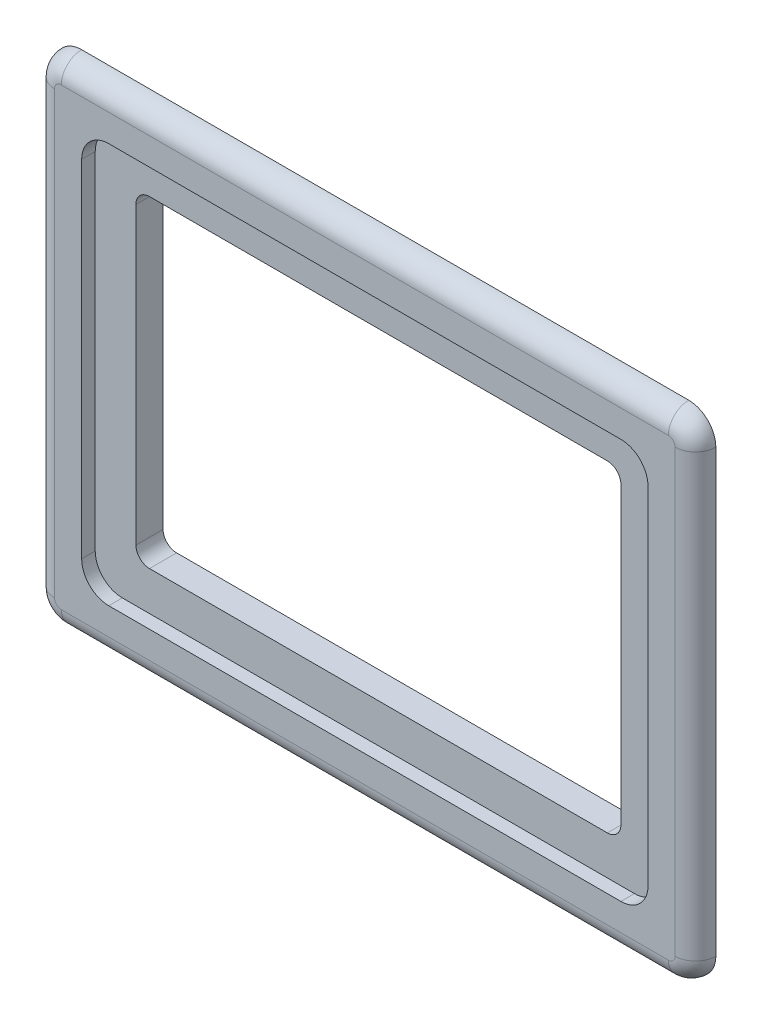
ISO-10303-21;
HEADER;
FILE_DESCRIPTION(('STEP AP214'),'2;1');
FILE_NAME('part.step','',(''),(''),'','','');
FILE_SCHEMA(('AUTOMOTIVE_DESIGN { 1 0 10303 214 1 1 1 1 }'));
ENDSEC;
DATA;
#1=APPLICATION_CONTEXT('core data for automotive mechanical design processes');
#2=APPLICATION_PROTOCOL_DEFINITION('international standard','automotive_design',2000,#1);
#3=PRODUCT_CONTEXT('',#1,'mechanical');
#4=PRODUCT('Part','Part','',(#3));
#5=PRODUCT_RELATED_PRODUCT_CATEGORY('part','',(#4));
#6=PRODUCT_DEFINITION_FORMATION('','',#4);
#7=PRODUCT_DEFINITION_CONTEXT('part definition',#1,'design');
#8=PRODUCT_DEFINITION('design','',#6,#7);
#9=PRODUCT_DEFINITION_SHAPE('','',#8);
#10=(LENGTH_UNIT() NAMED_UNIT(*) SI_UNIT(.MILLI.,.METRE.));
#11=(NAMED_UNIT(*) PLANE_ANGLE_UNIT() SI_UNIT($,.RADIAN.));
#12=(NAMED_UNIT(*) SI_UNIT($,.STERADIAN.) SOLID_ANGLE_UNIT());
#13=UNCERTAINTY_MEASURE_WITH_UNIT(LENGTH_MEASURE(1.E-05),#10,'distance_accuracy_value','');
#14=(GEOMETRIC_REPRESENTATION_CONTEXT(3) GLOBAL_UNCERTAINTY_ASSIGNED_CONTEXT((#13)) GLOBAL_UNIT_ASSIGNED_CONTEXT((#10,
#11,#12)) REPRESENTATION_CONTEXT('',''));
#15=CARTESIAN_POINT('',(0.,0.,0.));
#16=DIRECTION('',(0.,0.,1.));
#17=DIRECTION('',(1.,0.,0.));
#18=AXIS2_PLACEMENT_3D('',#15,#16,#17);
#19=CARTESIAN_POINT('',(113.50625,0.,9.525));
#20=DIRECTION('',(-1.,0.,0.));
#21=DIRECTION('',(0.,0.,1.));
#22=AXIS2_PLACEMENT_3D('',#19,#20,#21);
#23=PLANE('',#22);
#24=DIRECTION('',(0.,1.,0.));
#25=VECTOR('',#24,1.);
#26=CARTESIAN_POINT('',(113.50625,0.,-9.525));
#27=LINE('',#26,#25);
#28=CARTESIAN_POINT('',(113.50625,-69.05625,-9.525));
#29=VERTEX_POINT('',#28);
#30=CARTESIAN_POINT('',(113.50625,69.05625,-9.525));
#31=VERTEX_POINT('',#30);
#32=EDGE_CURVE('E447',#29,#31,#27,.T.);
#33=ORIENTED_EDGE('',*,*,#32,.F.);
#34=DIRECTION('',(0.,0.,-1.));
#35=VECTOR('',#34,1.);
#36=CARTESIAN_POINT('',(113.50625,-69.05625,3.175));
#37=LINE('',#36,#35);
#38=CARTESIAN_POINT('',(113.50625,-69.05625,3.175));
#39=VERTEX_POINT('',#38);
#40=EDGE_CURVE('E387',#29,#39,#37,.F.);
#41=ORIENTED_EDGE('',*,*,#40,.T.);
#42=DIRECTION('',(0.,-1.,0.));
#43=VECTOR('',#42,1.);
#44=CARTESIAN_POINT('',(113.50625,0.,3.175));
#45=LINE('',#44,#43);
#46=CARTESIAN_POINT('',(113.50625,69.05625,3.175));
#47=VERTEX_POINT('',#46);
#48=EDGE_CURVE('E506',#47,#39,#45,.T.);
#49=ORIENTED_EDGE('',*,*,#48,.F.);
#50=DIRECTION('',(0.,0.,-1.));
#51=VECTOR('',#50,1.);
#52=CARTESIAN_POINT('',(113.50625,69.05625,9.525));
#53=LINE('',#52,#51);
#54=EDGE_CURVE('E389',#47,#31,#53,.T.);
#55=ORIENTED_EDGE('',*,*,#54,.T.);
#56=EDGE_LOOP('',(#33,#41,#49,#55));
#57=FACE_BOUND('',#56,.T.);
#58=ADVANCED_FACE('F61',(#57),#23,.T.);
#59=CARTESIAN_POINT('',(0.,-75.40625,9.525));
#60=DIRECTION('',(0.,1.,0.));
#61=DIRECTION('',(0.,0.,1.));
#62=AXIS2_PLACEMENT_3D('',#59,#60,#61);
#63=PLANE('',#62);
#64=DIRECTION('',(-1.,0.,0.));
#65=VECTOR('',#64,1.);
#66=CARTESIAN_POINT('',(0.,-75.40625,3.175));
#67=LINE('',#66,#65);
#68=CARTESIAN_POINT('',(107.15625,-75.40625,3.175));
#69=VERTEX_POINT('',#68);
#70=CARTESIAN_POINT('',(-107.15625,-75.40625,3.175));
#71=VERTEX_POINT('',#70);
#72=EDGE_CURVE('E509',#69,#71,#67,.T.);
#73=ORIENTED_EDGE('',*,*,#72,.F.);
#74=DIRECTION('',(0.,0.,-1.));
#75=VECTOR('',#74,1.);
#76=CARTESIAN_POINT('',(107.15625,-75.40625,-9.525));
#77=LINE('',#76,#75);
#78=CARTESIAN_POINT('',(107.15625,-75.40625,-9.525));
#79=VERTEX_POINT('',#78);
#80=EDGE_CURVE('E392',#69,#79,#77,.T.);
#81=ORIENTED_EDGE('',*,*,#80,.T.);
#82=DIRECTION('',(1.,0.,0.));
#83=VECTOR('',#82,1.);
#84=CARTESIAN_POINT('',(0.,-75.40625,-9.525));
#85=LINE('',#84,#83);
#86=CARTESIAN_POINT('',(-107.15625,-75.40625,-9.525));
#87=VERTEX_POINT('',#86);
#88=EDGE_CURVE('E475',#87,#79,#85,.T.);
#89=ORIENTED_EDGE('',*,*,#88,.F.);
#90=DIRECTION('',(0.,0.,-1.));
#91=VECTOR('',#90,1.);
#92=CARTESIAN_POINT('',(-107.15625,-75.40625,9.525));
#93=LINE('',#92,#91);
#94=EDGE_CURVE('E395',#87,#71,#93,.F.);
#95=ORIENTED_EDGE('',*,*,#94,.T.);
#96=EDGE_LOOP('',(#73,#81,#89,#95));
#97=FACE_BOUND('',#96,.T.);
#98=ADVANCED_FACE('F532',(#97),#63,.T.);
#99=CARTESIAN_POINT('',(-113.50625,0.,9.525));
#100=DIRECTION('',(-1.,0.,0.));
#101=DIRECTION('',(0.,0.,1.));
#102=AXIS2_PLACEMENT_3D('',#99,#100,#101);
#103=PLANE('',#102);
#104=DIRECTION('',(0.,-1.,0.));
#105=VECTOR('',#104,1.);
#106=CARTESIAN_POINT('',(-113.50625,0.,3.175));
#107=LINE('',#106,#105);
#108=CARTESIAN_POINT('',(-113.50625,69.05625,3.175));
#109=VERTEX_POINT('',#108);
#110=CARTESIAN_POINT('',(-113.50625,-69.05625,3.175));
#111=VERTEX_POINT('',#110);
#112=EDGE_CURVE('E512',#109,#111,#107,.T.);
#113=ORIENTED_EDGE('',*,*,#112,.T.);
#114=DIRECTION('',(0.,0.,-1.));
#115=VECTOR('',#114,1.);
#116=CARTESIAN_POINT('',(-113.50625,-69.05625,9.525));
#117=LINE('',#116,#115);
#118=CARTESIAN_POINT('',(-113.50625,-69.05625,-9.525));
#119=VERTEX_POINT('',#118);
#120=EDGE_CURVE('E382',#111,#119,#117,.T.);
#121=ORIENTED_EDGE('',*,*,#120,.T.);
#122=DIRECTION('',(0.,1.,0.));
#123=VECTOR('',#122,1.);
#124=CARTESIAN_POINT('',(-113.50625,0.,-9.525));
#125=LINE('',#124,#123);
#126=CARTESIAN_POINT('',(-113.50625,69.05625,-9.525));
#127=VERTEX_POINT('',#126);
#128=EDGE_CURVE('E472',#119,#127,#125,.T.);
#129=ORIENTED_EDGE('',*,*,#128,.T.);
#130=DIRECTION('',(0.,0.,-1.));
#131=VECTOR('',#130,1.);
#132=CARTESIAN_POINT('',(-113.50625,69.05625,3.175));
#133=LINE('',#132,#131);
#134=EDGE_CURVE('E385',#127,#109,#133,.F.);
#135=ORIENTED_EDGE('',*,*,#134,.T.);
#136=EDGE_LOOP('',(#113,#121,#129,#135));
#137=FACE_BOUND('',#136,.T.);
#138=ADVANCED_FACE('F517',(#137),#103,.F.);
#139=CARTESIAN_POINT('',(0.,75.40625,9.525));
#140=DIRECTION('',(0.,1.,0.));
#141=DIRECTION('',(0.,0.,1.));
#142=AXIS2_PLACEMENT_3D('',#139,#140,#141);
#143=PLANE('',#142);
#144=DIRECTION('',(1.,0.,0.));
#145=VECTOR('',#144,1.);
#146=CARTESIAN_POINT('',(0.,75.40625,-9.525));
#147=LINE('',#146,#145);
#148=CARTESIAN_POINT('',(-107.15625,75.40625,-9.525));
#149=VERTEX_POINT('',#148);
#150=CARTESIAN_POINT('',(107.15625,75.40625,-9.525));
#151=VERTEX_POINT('',#150);
#152=EDGE_CURVE('E469',#149,#151,#147,.T.);
#153=ORIENTED_EDGE('',*,*,#152,.T.);
#154=DIRECTION('',(0.,0.,-1.));
#155=VECTOR('',#154,1.);
#156=CARTESIAN_POINT('',(107.15625,75.40625,9.525));
#157=LINE('',#156,#155);
#158=CARTESIAN_POINT('',(107.15625,75.40625,3.175));
#159=VERTEX_POINT('',#158);
#160=EDGE_CURVE('E377',#151,#159,#157,.F.);
#161=ORIENTED_EDGE('',*,*,#160,.T.);
#162=DIRECTION('',(-1.,0.,0.));
#163=VECTOR('',#162,1.);
#164=CARTESIAN_POINT('',(0.,75.40625,3.175));
#165=LINE('',#164,#163);
#166=CARTESIAN_POINT('',(-107.15625,75.40625,3.175));
#167=VERTEX_POINT('',#166);
#168=EDGE_CURVE('E493',#159,#167,#165,.T.);
#169=ORIENTED_EDGE('',*,*,#168,.T.);
#170=DIRECTION('',(0.,0.,-1.));
#171=VECTOR('',#170,1.);
#172=CARTESIAN_POINT('',(-107.15625,75.40625,-9.525));
#173=LINE('',#172,#171);
#174=EDGE_CURVE('E379',#167,#149,#173,.T.);
#175=ORIENTED_EDGE('',*,*,#174,.T.);
#176=EDGE_LOOP('',(#153,#161,#169,#175));
#177=FACE_BOUND('',#176,.T.);
#178=ADVANCED_FACE('F548',(#177),#143,.F.);
#179=CARTESIAN_POINT('',(0.,0.,9.525));
#180=DIRECTION('',(0.,0.,1.));
#181=DIRECTION('',(1.,0.,0.));
#182=AXIS2_PLACEMENT_3D('',#179,#180,#181);
#183=PLANE('',#182);
#184=DIRECTION('',(0.,1.,0.));
#185=VECTOR('',#184,1.);
#186=CARTESIAN_POINT('',(-145.25625,0.,9.525));
#187=LINE('',#186,#185);
#188=CARTESIAN_POINT('',(-145.25625,103.1875,9.525));
#189=VERTEX_POINT('',#188);
#190=CARTESIAN_POINT('',(-145.25625,-103.1875,9.525));
#191=VERTEX_POINT('',#190);
#192=EDGE_CURVE('E323',#189,#191,#187,.F.);
#193=ORIENTED_EDGE('',*,*,#192,.T.);
#194=CARTESIAN_POINT('',(-142.08125,-103.1875,9.525));
#195=DIRECTION('',(0.,0.,1.));
#196=DIRECTION('',(1.,0.,0.));
#197=AXIS2_PLACEMENT_3D('',#194,#195,#196);
#198=CIRCLE('',#197,3.175);
#199=CARTESIAN_POINT('',(-142.08125,-106.3625,9.525));
#200=VERTEX_POINT('',#199);
#201=EDGE_CURVE('E12',#191,#200,#198,.T.);
#202=ORIENTED_EDGE('',*,*,#201,.T.);
#203=DIRECTION('',(1.,0.,0.));
#204=VECTOR('',#203,1.);
#205=CARTESIAN_POINT('',(142.08125,-106.3625,9.525));
#206=LINE('',#205,#204);
#207=CARTESIAN_POINT('',(142.08125,-106.3625,9.525));
#208=VERTEX_POINT('',#207);
#209=EDGE_CURVE('E70',#200,#208,#206,.T.);
#210=ORIENTED_EDGE('',*,*,#209,.T.);
#211=CARTESIAN_POINT('',(142.08125,-103.1875,9.525));
#212=DIRECTION('',(0.,0.,1.));
#213=DIRECTION('',(1.,0.,0.));
#214=AXIS2_PLACEMENT_3D('',#211,#212,#213);
#215=CIRCLE('',#214,3.175);
#216=CARTESIAN_POINT('',(145.25625,-103.1875,9.525));
#217=VERTEX_POINT('',#216);
#218=EDGE_CURVE('E314',#208,#217,#215,.T.);
#219=ORIENTED_EDGE('',*,*,#218,.T.);
#220=DIRECTION('',(0.,1.,0.));
#221=VECTOR('',#220,1.);
#222=CARTESIAN_POINT('',(145.25625,103.1875,9.525));
#223=LINE('',#222,#221);
#224=CARTESIAN_POINT('',(145.25625,103.1875,9.525));
#225=VERTEX_POINT('',#224);
#226=EDGE_CURVE('E316',#217,#225,#223,.T.);
#227=ORIENTED_EDGE('',*,*,#226,.T.);
#228=CARTESIAN_POINT('',(142.08125,103.1875,9.525));
#229=DIRECTION('',(0.,0.,1.));
#230=DIRECTION('',(1.,0.,0.));
#231=AXIS2_PLACEMENT_3D('',#228,#229,#230);
#232=CIRCLE('',#231,3.175);
#233=CARTESIAN_POINT('',(142.08125,106.3625,9.525));
#234=VERTEX_POINT('',#233);
#235=EDGE_CURVE('E318',#225,#234,#232,.T.);
#236=ORIENTED_EDGE('',*,*,#235,.T.);
#237=DIRECTION('',(1.,0.,0.));
#238=VECTOR('',#237,1.);
#239=CARTESIAN_POINT('',(0.,106.3625,9.525));
#240=LINE('',#239,#238);
#241=CARTESIAN_POINT('',(-142.08125,106.3625,9.525));
#242=VERTEX_POINT('',#241);
#243=EDGE_CURVE('E320',#234,#242,#240,.F.);
#244=ORIENTED_EDGE('',*,*,#243,.T.);
#245=CARTESIAN_POINT('',(-142.08125,103.1875,9.525));
#246=DIRECTION('',(0.,0.,1.));
#247=DIRECTION('',(1.,0.,0.));
#248=AXIS2_PLACEMENT_3D('',#245,#246,#247);
#249=CIRCLE('',#248,3.175);
#250=EDGE_CURVE('E297',#242,#189,#249,.T.);
#251=ORIENTED_EDGE('',*,*,#250,.T.);
#252=EDGE_LOOP('',(#193,#202,#210,#219,#227,#236,#244,#251));
#253=FACE_BOUND('',#252,.T.);
#254=DIRECTION('',(0.,-1.,0.));
#255=VECTOR('',#254,1.);
#256=CARTESIAN_POINT('',(-132.55625,0.,9.525));
#257=LINE('',#256,#255);
#258=CARTESIAN_POINT('',(-132.55625,80.9625,9.525));
#259=VERTEX_POINT('',#258);
#260=CARTESIAN_POINT('',(-132.55625,-80.9625,9.525));
#261=VERTEX_POINT('',#260);
#262=EDGE_CURVE('E490',#259,#261,#257,.T.);
#263=ORIENTED_EDGE('',*,*,#262,.F.);
#264=CARTESIAN_POINT('',(-119.85625,80.9625,9.525));
#265=DIRECTION('',(0.,0.,1.));
#266=DIRECTION('',(1.,0.,0.));
#267=AXIS2_PLACEMENT_3D('',#264,#265,#266);
#268=CIRCLE('',#267,12.7);
#269=CARTESIAN_POINT('',(-119.85625,93.6625,9.525));
#270=VERTEX_POINT('',#269);
#271=EDGE_CURVE('E325',#259,#270,#268,.F.);
#272=ORIENTED_EDGE('',*,*,#271,.T.);
#273=DIRECTION('',(-1.,0.,0.));
#274=VECTOR('',#273,1.);
#275=CARTESIAN_POINT('',(0.,93.6625,9.525));
#276=LINE('',#275,#274);
#277=CARTESIAN_POINT('',(119.85625,93.6625,9.525));
#278=VERTEX_POINT('',#277);
#279=EDGE_CURVE('E480',#278,#270,#276,.T.);
#280=ORIENTED_EDGE('',*,*,#279,.F.);
#281=CARTESIAN_POINT('',(119.85625,80.9625,9.525));
#282=DIRECTION('',(0.,0.,1.));
#283=DIRECTION('',(1.,0.,0.));
#284=AXIS2_PLACEMENT_3D('',#281,#282,#283);
#285=CIRCLE('',#284,12.7);
#286=CARTESIAN_POINT('',(132.55625,80.9625,9.525));
#287=VERTEX_POINT('',#286);
#288=EDGE_CURVE('E331',#278,#287,#285,.F.);
#289=ORIENTED_EDGE('',*,*,#288,.T.);
#290=DIRECTION('',(0.,-1.,0.));
#291=VECTOR('',#290,1.);
#292=CARTESIAN_POINT('',(132.55625,0.,9.525));
#293=LINE('',#292,#291);
#294=CARTESIAN_POINT('',(132.55625,-80.9625,9.525));
#295=VERTEX_POINT('',#294);
#296=EDGE_CURVE('E484',#287,#295,#293,.T.);
#297=ORIENTED_EDGE('',*,*,#296,.T.);
#298=CARTESIAN_POINT('',(119.85625,-80.9625,9.525));
#299=DIRECTION('',(0.,0.,1.));
#300=DIRECTION('',(1.,0.,0.));
#301=AXIS2_PLACEMENT_3D('',#298,#299,#300);
#302=CIRCLE('',#301,12.7);
#303=CARTESIAN_POINT('',(119.85625,-93.6625,9.525));
#304=VERTEX_POINT('',#303);
#305=EDGE_CURVE('E329',#295,#304,#302,.F.);
#306=ORIENTED_EDGE('',*,*,#305,.T.);
#307=DIRECTION('',(-1.,0.,0.));
#308=VECTOR('',#307,1.);
#309=CARTESIAN_POINT('',(0.,-93.6625,9.525));
#310=LINE('',#309,#308);
#311=CARTESIAN_POINT('',(-119.85625,-93.6625,9.525));
#312=VERTEX_POINT('',#311);
#313=EDGE_CURVE('E487',#304,#312,#310,.T.);
#314=ORIENTED_EDGE('',*,*,#313,.T.);
#315=CARTESIAN_POINT('',(-119.85625,-80.9625,9.525));
#316=DIRECTION('',(0.,0.,1.));
#317=DIRECTION('',(1.,0.,0.));
#318=AXIS2_PLACEMENT_3D('',#315,#316,#317);
#319=CIRCLE('',#318,12.7);
#320=EDGE_CURVE('E327',#312,#261,#319,.F.);
#321=ORIENTED_EDGE('',*,*,#320,.T.);
#322=EDGE_LOOP('',(#263,#272,#280,#289,#297,#306,#314,#321));
#323=FACE_BOUND('',#322,.T.);
#324=ADVANCED_FACE('F575',(#253,#323),#183,.T.);
#325=CARTESIAN_POINT('',(0.,0.,0.));
#326=DIRECTION('',(0.,0.,1.));
#327=DIRECTION('',(1.,0.,0.));
#328=AXIS2_PLACEMENT_3D('',#325,#326,#327);
#329=PLANE('',#328);
#330=DIRECTION('',(0.,1.,0.));
#331=VECTOR('',#330,1.);
#332=CARTESIAN_POINT('',(-132.55625,0.,0.));
#333=LINE('',#332,#331);
#334=CARTESIAN_POINT('',(-132.55625,-80.9625,0.));
#335=VERTEX_POINT('',#334);
#336=CARTESIAN_POINT('',(-132.55625,80.9625,0.));
#337=VERTEX_POINT('',#336);
#338=EDGE_CURVE('E444',#335,#337,#333,.T.);
#339=ORIENTED_EDGE('',*,*,#338,.F.);
#340=CARTESIAN_POINT('',(-119.85625,-80.9625,0.));
#341=DIRECTION('',(0.,0.,1.));
#342=DIRECTION('',(1.,0.,0.));
#343=AXIS2_PLACEMENT_3D('',#340,#341,#342);
#344=CIRCLE('',#343,12.7);
#345=CARTESIAN_POINT('',(-119.85625,-93.6625,0.));
#346=VERTEX_POINT('',#345);
#347=EDGE_CURVE('E397',#335,#346,#344,.T.);
#348=ORIENTED_EDGE('',*,*,#347,.T.);
#349=DIRECTION('',(1.,0.,0.));
#350=VECTOR('',#349,1.);
#351=CARTESIAN_POINT('',(0.,-93.6625,0.));
#352=LINE('',#351,#350);
#353=CARTESIAN_POINT('',(119.85625,-93.6625,0.));
#354=VERTEX_POINT('',#353);
#355=EDGE_CURVE('E454',#346,#354,#352,.T.);
#356=ORIENTED_EDGE('',*,*,#355,.T.);
#357=CARTESIAN_POINT('',(119.85625,-80.9625,0.));
#358=DIRECTION('',(0.,0.,1.));
#359=DIRECTION('',(1.,0.,0.));
#360=AXIS2_PLACEMENT_3D('',#357,#358,#359);
#361=CIRCLE('',#360,12.7);
#362=CARTESIAN_POINT('',(132.55625,-80.9625,0.));
#363=VERTEX_POINT('',#362);
#364=EDGE_CURVE('E403',#354,#363,#361,.T.);
#365=ORIENTED_EDGE('',*,*,#364,.T.);
#366=DIRECTION('',(0.,1.,0.));
#367=VECTOR('',#366,1.);
#368=CARTESIAN_POINT('',(132.55625,0.,0.));
#369=LINE('',#368,#367);
#370=CARTESIAN_POINT('',(132.55625,80.9624999999999,0.));
#371=VERTEX_POINT('',#370);
#372=EDGE_CURVE('E451',#363,#371,#369,.T.);
#373=ORIENTED_EDGE('',*,*,#372,.T.);
#374=CARTESIAN_POINT('',(119.85625,80.9624999999999,0.));
#375=DIRECTION('',(0.,0.,1.));
#376=DIRECTION('',(1.,0.,0.));
#377=AXIS2_PLACEMENT_3D('',#374,#375,#376);
#378=CIRCLE('',#377,12.7);
#379=CARTESIAN_POINT('',(119.85625,93.6625,0.));
#380=VERTEX_POINT('',#379);
#381=EDGE_CURVE('E401',#371,#380,#378,.T.);
#382=ORIENTED_EDGE('',*,*,#381,.T.);
#383=DIRECTION('',(1.,0.,0.));
#384=VECTOR('',#383,1.);
#385=CARTESIAN_POINT('',(0.,93.6625,0.));
#386=LINE('',#385,#384);
#387=CARTESIAN_POINT('',(-119.85625,93.6625,0.));
#388=VERTEX_POINT('',#387);
#389=EDGE_CURVE('E448',#388,#380,#386,.T.);
#390=ORIENTED_EDGE('',*,*,#389,.F.);
#391=CARTESIAN_POINT('',(-119.85625,80.9625,0.));
#392=DIRECTION('',(0.,0.,1.));
#393=DIRECTION('',(1.,0.,0.));
#394=AXIS2_PLACEMENT_3D('',#391,#392,#393);
#395=CIRCLE('',#394,12.7);
#396=EDGE_CURVE('E399',#388,#337,#395,.T.);
#397=ORIENTED_EDGE('',*,*,#396,.T.);
#398=EDGE_LOOP('',(#339,#348,#356,#365,#373,#382,#390,#397));
#399=FACE_BOUND('',#398,.T.);
#400=DIRECTION('',(1.,0.,0.));
#401=VECTOR('',#400,1.);
#402=CARTESIAN_POINT('',(0.,115.8875,0.));
#403=LINE('',#402,#401);
#404=CARTESIAN_POINT('',(-142.08125,115.8875,0.));
#405=VERTEX_POINT('',#404);
#406=CARTESIAN_POINT('',(142.08125,115.8875,0.));
#407=VERTEX_POINT('',#406);
#408=EDGE_CURVE('E274',#405,#407,#403,.T.);
#409=ORIENTED_EDGE('',*,*,#408,.T.);
#410=CARTESIAN_POINT('',(142.08125,103.1875,0.));
#411=DIRECTION('',(0.,0.,1.));
#412=DIRECTION('',(1.,0.,0.));
#413=AXIS2_PLACEMENT_3D('',#410,#411,#412);
#414=CIRCLE('',#413,12.7);
#415=CARTESIAN_POINT('',(154.78125,103.1875,0.));
#416=VERTEX_POINT('',#415);
#417=EDGE_CURVE('E433',#407,#416,#414,.F.);
#418=ORIENTED_EDGE('',*,*,#417,.T.);
#419=DIRECTION('',(0.,1.,0.));
#420=VECTOR('',#419,1.);
#421=CARTESIAN_POINT('',(154.78125,0.,0.));
#422=LINE('',#421,#420);
#423=CARTESIAN_POINT('',(154.78125,-103.1875,0.));
#424=VERTEX_POINT('',#423);
#425=EDGE_CURVE('E294',#424,#416,#422,.T.);
#426=ORIENTED_EDGE('',*,*,#425,.F.);
#427=CARTESIAN_POINT('',(142.08125,-103.1875,0.));
#428=DIRECTION('',(0.,0.,1.));
#429=DIRECTION('',(1.,0.,0.));
#430=AXIS2_PLACEMENT_3D('',#427,#428,#429);
#431=CIRCLE('',#430,12.7);
#432=CARTESIAN_POINT('',(142.08125,-115.8875,0.));
#433=VERTEX_POINT('',#432);
#434=EDGE_CURVE('E283',#424,#433,#431,.F.);
#435=ORIENTED_EDGE('',*,*,#434,.T.);
#436=DIRECTION('',(1.,0.,0.));
#437=VECTOR('',#436,1.);
#438=CARTESIAN_POINT('',(0.,-115.8875,0.));
#439=LINE('',#438,#437);
#440=CARTESIAN_POINT('',(-142.08125,-115.8875,0.));
#441=VERTEX_POINT('',#440);
#442=EDGE_CURVE('E440',#441,#433,#439,.T.);
#443=ORIENTED_EDGE('',*,*,#442,.F.);
#444=CARTESIAN_POINT('',(-142.08125,-103.1875,0.));
#445=DIRECTION('',(0.,0.,1.));
#446=DIRECTION('',(1.,0.,0.));
#447=AXIS2_PLACEMENT_3D('',#444,#445,#446);
#448=CIRCLE('',#447,12.7);
#449=CARTESIAN_POINT('',(-154.78125,-103.1875,0.));
#450=VERTEX_POINT('',#449);
#451=EDGE_CURVE('E284',#441,#450,#448,.F.);
#452=ORIENTED_EDGE('',*,*,#451,.T.);
#453=DIRECTION('',(0.,1.,0.));
#454=VECTOR('',#453,1.);
#455=CARTESIAN_POINT('',(-154.78125,0.,0.));
#456=LINE('',#455,#454);
#457=CARTESIAN_POINT('',(-154.78125,103.1875,0.));
#458=VERTEX_POINT('',#457);
#459=EDGE_CURVE('E278',#450,#458,#456,.T.);
#460=ORIENTED_EDGE('',*,*,#459,.T.);
#461=CARTESIAN_POINT('',(-142.08125,103.1875,0.));
#462=DIRECTION('',(0.,0.,1.));
#463=DIRECTION('',(1.,0.,0.));
#464=AXIS2_PLACEMENT_3D('',#461,#462,#463);
#465=CIRCLE('',#464,12.7);
#466=EDGE_CURVE('E271',#458,#405,#465,.F.);
#467=ORIENTED_EDGE('',*,*,#466,.T.);
#468=EDGE_LOOP('',(#409,#418,#426,#435,#443,#452,#460,#467));
#469=FACE_BOUND('',#468,.T.);
#470=ADVANCED_FACE('F273',(#399,#469),#329,.F.);
#471=CARTESIAN_POINT('',(0.,-93.6625,-9.525));
#472=DIRECTION('',(0.,-1.,0.));
#473=DIRECTION('',(0.,0.,-1.));
#474=AXIS2_PLACEMENT_3D('',#471,#472,#473);
#475=PLANE('',#474);
#476=DIRECTION('',(1.,0.,0.));
#477=VECTOR('',#476,1.);
#478=CARTESIAN_POINT('',(0.,-93.6625,-9.525));
#479=LINE('',#478,#477);
#480=CARTESIAN_POINT('',(-119.85625,-93.6625,-9.525));
#481=VERTEX_POINT('',#480);
#482=CARTESIAN_POINT('',(119.85625,-93.6625,-9.525));
#483=VERTEX_POINT('',#482);
#484=EDGE_CURVE('E466',#481,#483,#479,.T.);
#485=ORIENTED_EDGE('',*,*,#484,.T.);
#486=DIRECTION('',(0.,0.,1.));
#487=VECTOR('',#486,1.);
#488=CARTESIAN_POINT('',(119.85625,-93.6625,-9.525));
#489=LINE('',#488,#487);
#490=EDGE_CURVE('E428',#483,#354,#489,.T.);
#491=ORIENTED_EDGE('',*,*,#490,.T.);
#492=ORIENTED_EDGE('',*,*,#355,.F.);
#493=DIRECTION('',(0.,0.,1.));
#494=VECTOR('',#493,1.);
#495=CARTESIAN_POINT('',(-119.85625,-93.6625,-9.525));
#496=LINE('',#495,#494);
#497=EDGE_CURVE('E431',#346,#481,#496,.F.);
#498=ORIENTED_EDGE('',*,*,#497,.T.);
#499=EDGE_LOOP('',(#485,#491,#492,#498));
#500=FACE_BOUND('',#499,.T.);
#501=ADVANCED_FACE('F684',(#500),#475,.T.);
#502=CARTESIAN_POINT('',(-132.55625,0.,-9.525));
#503=DIRECTION('',(1.,0.,0.));
#504=DIRECTION('',(0.,0.,-1.));
#505=AXIS2_PLACEMENT_3D('',#502,#503,#504);
#506=PLANE('',#505);
#507=ORIENTED_EDGE('',*,*,#338,.T.);
#508=DIRECTION('',(0.,0.,1.));
#509=VECTOR('',#508,1.);
#510=CARTESIAN_POINT('',(-132.55625,80.9625,-9.525));
#511=LINE('',#510,#509);
#512=CARTESIAN_POINT('',(-132.55625,80.9625,-9.525));
#513=VERTEX_POINT('',#512);
#514=EDGE_CURVE('E405',#337,#513,#511,.F.);
#515=ORIENTED_EDGE('',*,*,#514,.T.);
#516=DIRECTION('',(0.,1.,0.));
#517=VECTOR('',#516,1.);
#518=CARTESIAN_POINT('',(-132.55625,0.,-9.525));
#519=LINE('',#518,#517);
#520=CARTESIAN_POINT('',(-132.55625,-80.9625,-9.525));
#521=VERTEX_POINT('',#520);
#522=EDGE_CURVE('E443',#521,#513,#519,.T.);
#523=ORIENTED_EDGE('',*,*,#522,.F.);
#524=DIRECTION('',(0.,0.,1.));
#525=VECTOR('',#524,1.);
#526=CARTESIAN_POINT('',(-132.55625,-80.9625,0.));
#527=LINE('',#526,#525);
#528=EDGE_CURVE('E407',#521,#335,#527,.T.);
#529=ORIENTED_EDGE('',*,*,#528,.T.);
#530=EDGE_LOOP('',(#507,#515,#523,#529));
#531=FACE_BOUND('',#530,.T.);
#532=ADVANCED_FACE('F865',(#531),#506,.F.);
#533=CARTESIAN_POINT('',(0.,93.6625,-9.525));
#534=DIRECTION('',(0.,-1.,0.));
#535=DIRECTION('',(0.,0.,-1.));
#536=AXIS2_PLACEMENT_3D('',#533,#534,#535);
#537=PLANE('',#536);
#538=ORIENTED_EDGE('',*,*,#389,.T.);
#539=DIRECTION('',(0.,0.,1.));
#540=VECTOR('',#539,1.);
#541=CARTESIAN_POINT('',(119.85625,93.6625,-9.525));
#542=LINE('',#541,#540);
#543=CARTESIAN_POINT('',(119.85625,93.6625,-9.525));
#544=VERTEX_POINT('',#543);
#545=EDGE_CURVE('E410',#380,#544,#542,.F.);
#546=ORIENTED_EDGE('',*,*,#545,.T.);
#547=DIRECTION('',(1.,0.,0.));
#548=VECTOR('',#547,1.);
#549=CARTESIAN_POINT('',(0.,93.6625,-9.525));
#550=LINE('',#549,#548);
#551=CARTESIAN_POINT('',(-119.85625,93.6625,-9.525));
#552=VERTEX_POINT('',#551);
#553=EDGE_CURVE('E460',#552,#544,#550,.T.);
#554=ORIENTED_EDGE('',*,*,#553,.F.);
#555=DIRECTION('',(0.,0.,1.));
#556=VECTOR('',#555,1.);
#557=CARTESIAN_POINT('',(-119.85625,93.6625,-9.525));
#558=LINE('',#557,#556);
#559=EDGE_CURVE('E412',#552,#388,#558,.T.);
#560=ORIENTED_EDGE('',*,*,#559,.T.);
#561=EDGE_LOOP('',(#538,#546,#554,#560));
#562=FACE_BOUND('',#561,.T.);
#563=ADVANCED_FACE('F871',(#562),#537,.F.);
#564=CARTESIAN_POINT('',(132.55625,0.,-9.525));
#565=DIRECTION('',(1.,0.,0.));
#566=DIRECTION('',(0.,0.,-1.));
#567=AXIS2_PLACEMENT_3D('',#564,#565,#566);
#568=PLANE('',#567);
#569=ORIENTED_EDGE('',*,*,#372,.F.);
#570=DIRECTION('',(0.,0.,1.));
#571=VECTOR('',#570,1.);
#572=CARTESIAN_POINT('',(132.55625,-80.9625,-9.525));
#573=LINE('',#572,#571);
#574=CARTESIAN_POINT('',(132.55625,-80.9625,-9.525));
#575=VERTEX_POINT('',#574);
#576=EDGE_CURVE('E423',#363,#575,#573,.F.);
#577=ORIENTED_EDGE('',*,*,#576,.T.);
#578=DIRECTION('',(0.,1.,0.));
#579=VECTOR('',#578,1.);
#580=CARTESIAN_POINT('',(132.55625,0.,-9.525));
#581=LINE('',#580,#579);
#582=CARTESIAN_POINT('',(132.55625,80.9624999999999,-9.525));
#583=VERTEX_POINT('',#582);
#584=EDGE_CURVE('E463',#575,#583,#581,.T.);
#585=ORIENTED_EDGE('',*,*,#584,.T.);
#586=DIRECTION('',(0.,0.,1.));
#587=VECTOR('',#586,1.);
#588=CARTESIAN_POINT('',(132.55625,80.9624999999999,0.));
#589=LINE('',#588,#587);
#590=EDGE_CURVE('E425',#583,#371,#589,.T.);
#591=ORIENTED_EDGE('',*,*,#590,.T.);
#592=EDGE_LOOP('',(#569,#577,#585,#591));
#593=FACE_BOUND('',#592,.T.);
#594=ADVANCED_FACE('F710',(#593),#568,.T.);
#595=CARTESIAN_POINT('',(0.,0.,-9.525));
#596=DIRECTION('',(0.,0.,1.));
#597=DIRECTION('',(1.,0.,0.));
#598=AXIS2_PLACEMENT_3D('',#595,#596,#597);
#599=PLANE('',#598);
#600=ORIENTED_EDGE('',*,*,#88,.T.);
#601=CARTESIAN_POINT('',(107.15625,-69.05625,-9.525));
#602=DIRECTION('',(0.,0.,1.));
#603=DIRECTION('',(1.,0.,0.));
#604=AXIS2_PLACEMENT_3D('',#601,#602,#603);
#605=CIRCLE('',#604,6.35);
#606=EDGE_CURVE('E375',#79,#29,#605,.T.);
#607=ORIENTED_EDGE('',*,*,#606,.T.);
#608=ORIENTED_EDGE('',*,*,#32,.T.);
#609=CARTESIAN_POINT('',(107.15625,69.05625,-9.525));
#610=DIRECTION('',(0.,0.,1.));
#611=DIRECTION('',(1.,0.,0.));
#612=AXIS2_PLACEMENT_3D('',#609,#610,#611);
#613=CIRCLE('',#612,6.35);
#614=EDGE_CURVE('E367',#31,#151,#613,.T.);
#615=ORIENTED_EDGE('',*,*,#614,.T.);
#616=ORIENTED_EDGE('',*,*,#152,.F.);
#617=CARTESIAN_POINT('',(-107.15625,69.05625,-9.525));
#618=DIRECTION('',(0.,0.,1.));
#619=DIRECTION('',(1.,0.,0.));
#620=AXIS2_PLACEMENT_3D('',#617,#618,#619);
#621=CIRCLE('',#620,6.35);
#622=EDGE_CURVE('E363',#149,#127,#621,.T.);
#623=ORIENTED_EDGE('',*,*,#622,.T.);
#624=ORIENTED_EDGE('',*,*,#128,.F.);
#625=CARTESIAN_POINT('',(-107.15625,-69.05625,-9.525));
#626=DIRECTION('',(0.,0.,1.));
#627=DIRECTION('',(1.,0.,0.));
#628=AXIS2_PLACEMENT_3D('',#625,#626,#627);
#629=CIRCLE('',#628,6.35);
#630=EDGE_CURVE('E371',#119,#87,#629,.T.);
#631=ORIENTED_EDGE('',*,*,#630,.T.);
#632=EDGE_LOOP('',(#600,#607,#608,#615,#616,#623,#624,#631));
#633=FACE_BOUND('',#632,.T.);
#634=ORIENTED_EDGE('',*,*,#584,.F.);
#635=CARTESIAN_POINT('',(119.85625,-80.9625,-9.525));
#636=DIRECTION('',(0.,0.,1.));
#637=DIRECTION('',(1.,0.,0.));
#638=AXIS2_PLACEMENT_3D('',#635,#636,#637);
#639=CIRCLE('',#638,12.7);
#640=EDGE_CURVE('E415',#575,#483,#639,.F.);
#641=ORIENTED_EDGE('',*,*,#640,.T.);
#642=ORIENTED_EDGE('',*,*,#484,.F.);
#643=CARTESIAN_POINT('',(-119.85625,-80.9625,-9.525));
#644=DIRECTION('',(0.,0.,1.));
#645=DIRECTION('',(1.,0.,0.));
#646=AXIS2_PLACEMENT_3D('',#643,#644,#645);
#647=CIRCLE('',#646,12.7);
#648=EDGE_CURVE('E421',#481,#521,#647,.F.);
#649=ORIENTED_EDGE('',*,*,#648,.T.);
#650=ORIENTED_EDGE('',*,*,#522,.T.);
#651=CARTESIAN_POINT('',(-119.85625,80.9625,-9.525));
#652=DIRECTION('',(0.,0.,1.));
#653=DIRECTION('',(1.,0.,0.));
#654=AXIS2_PLACEMENT_3D('',#651,#652,#653);
#655=CIRCLE('',#654,12.7);
#656=EDGE_CURVE('E419',#513,#552,#655,.F.);
#657=ORIENTED_EDGE('',*,*,#656,.T.);
#658=ORIENTED_EDGE('',*,*,#553,.T.);
#659=CARTESIAN_POINT('',(119.85625,80.9624999999999,-9.525));
#660=DIRECTION('',(0.,0.,1.));
#661=DIRECTION('',(1.,0.,0.));
#662=AXIS2_PLACEMENT_3D('',#659,#660,#661);
#663=CIRCLE('',#662,12.7);
#664=EDGE_CURVE('E417',#544,#583,#663,.F.);
#665=ORIENTED_EDGE('',*,*,#664,.T.);
#666=EDGE_LOOP('',(#634,#641,#642,#649,#650,#657,#658,#665));
#667=FACE_BOUND('',#666,.T.);
#668=ADVANCED_FACE('F528',(#633,#667),#599,.F.);
#669=CARTESIAN_POINT('',(119.85625,-80.9625,-9.525));
#670=DIRECTION('',(0.,0.,1.));
#671=DIRECTION('',(1.,0.,0.));
#672=AXIS2_PLACEMENT_3D('',#669,#670,#671);
#673=CYLINDRICAL_SURFACE('',#672,12.7);
#674=ORIENTED_EDGE('',*,*,#640,.F.);
#675=ORIENTED_EDGE('',*,*,#576,.F.);
#676=ORIENTED_EDGE('',*,*,#364,.F.);
#677=ORIENTED_EDGE('',*,*,#490,.F.);
#678=EDGE_LOOP('',(#674,#675,#676,#677));
#679=FACE_BOUND('',#678,.T.);
#680=ADVANCED_FACE('F611',(#679),#673,.T.);
#681=CARTESIAN_POINT('',(119.85625,80.9624999999999,-9.525));
#682=DIRECTION('',(0.,0.,-1.));
#683=DIRECTION('',(-1.,0.,0.));
#684=AXIS2_PLACEMENT_3D('',#681,#682,#683);
#685=CYLINDRICAL_SURFACE('',#684,12.7);
#686=ORIENTED_EDGE('',*,*,#664,.F.);
#687=ORIENTED_EDGE('',*,*,#545,.F.);
#688=ORIENTED_EDGE('',*,*,#381,.F.);
#689=ORIENTED_EDGE('',*,*,#590,.F.);
#690=EDGE_LOOP('',(#686,#687,#688,#689));
#691=FACE_BOUND('',#690,.T.);
#692=ADVANCED_FACE('F614',(#691),#685,.T.);
#693=CARTESIAN_POINT('',(-119.85625,80.9625,-9.525));
#694=DIRECTION('',(0.,0.,1.));
#695=DIRECTION('',(1.,0.,0.));
#696=AXIS2_PLACEMENT_3D('',#693,#694,#695);
#697=CYLINDRICAL_SURFACE('',#696,12.7);
#698=ORIENTED_EDGE('',*,*,#656,.F.);
#699=ORIENTED_EDGE('',*,*,#514,.F.);
#700=ORIENTED_EDGE('',*,*,#396,.F.);
#701=ORIENTED_EDGE('',*,*,#559,.F.);
#702=EDGE_LOOP('',(#698,#699,#700,#701));
#703=FACE_BOUND('',#702,.T.);
#704=ADVANCED_FACE('F618',(#703),#697,.T.);
#705=CARTESIAN_POINT('',(-119.85625,-80.9625,-9.525));
#706=DIRECTION('',(0.,0.,-1.));
#707=DIRECTION('',(-1.,0.,0.));
#708=AXIS2_PLACEMENT_3D('',#705,#706,#707);
#709=CYLINDRICAL_SURFACE('',#708,12.7);
#710=ORIENTED_EDGE('',*,*,#648,.F.);
#711=ORIENTED_EDGE('',*,*,#497,.F.);
#712=ORIENTED_EDGE('',*,*,#347,.F.);
#713=ORIENTED_EDGE('',*,*,#528,.F.);
#714=EDGE_LOOP('',(#710,#711,#712,#713));
#715=FACE_BOUND('',#714,.T.);
#716=ADVANCED_FACE('F622',(#715),#709,.T.);
#717=CARTESIAN_POINT('',(-132.55625,0.,3.175));
#718=DIRECTION('',(-1.,0.,0.));
#719=DIRECTION('',(0.,0.,1.));
#720=AXIS2_PLACEMENT_3D('',#717,#718,#719);
#721=PLANE('',#720);
#722=ORIENTED_EDGE('',*,*,#262,.T.);
#723=DIRECTION('',(0.,0.,1.));
#724=VECTOR('',#723,1.);
#725=CARTESIAN_POINT('',(-132.55625,-80.9625,3.175));
#726=LINE('',#725,#724);
#727=CARTESIAN_POINT('',(-132.55625,-80.9625,3.175));
#728=VERTEX_POINT('',#727);
#729=EDGE_CURVE('E333',#261,#728,#726,.F.);
#730=ORIENTED_EDGE('',*,*,#729,.T.);
#731=DIRECTION('',(0.,-1.,0.));
#732=VECTOR('',#731,1.);
#733=CARTESIAN_POINT('',(-132.55625,0.,3.175));
#734=LINE('',#733,#732);
#735=CARTESIAN_POINT('',(-132.55625,80.9625,3.175));
#736=VERTEX_POINT('',#735);
#737=EDGE_CURVE('E483',#736,#728,#734,.T.);
#738=ORIENTED_EDGE('',*,*,#737,.F.);
#739=DIRECTION('',(0.,0.,1.));
#740=VECTOR('',#739,1.);
#741=CARTESIAN_POINT('',(-132.55625,80.9625,9.525));
#742=LINE('',#741,#740);
#743=EDGE_CURVE('E335',#736,#259,#742,.T.);
#744=ORIENTED_EDGE('',*,*,#743,.T.);
#745=EDGE_LOOP('',(#722,#730,#738,#744));
#746=FACE_BOUND('',#745,.T.);
#747=ADVANCED_FACE('F583',(#746),#721,.F.);
#748=CARTESIAN_POINT('',(0.,93.6625,3.175));
#749=DIRECTION('',(0.,1.,0.));
#750=DIRECTION('',(0.,0.,1.));
#751=AXIS2_PLACEMENT_3D('',#748,#749,#750);
#752=PLANE('',#751);
#753=DIRECTION('',(-1.,0.,0.));
#754=VECTOR('',#753,1.);
#755=CARTESIAN_POINT('',(0.,93.6625,3.175));
#756=LINE('',#755,#754);
#757=CARTESIAN_POINT('',(119.85625,93.6625,3.175));
#758=VERTEX_POINT('',#757);
#759=CARTESIAN_POINT('',(-119.85625,93.6625,3.175));
#760=VERTEX_POINT('',#759);
#761=EDGE_CURVE('E457',#758,#760,#756,.T.);
#762=ORIENTED_EDGE('',*,*,#761,.F.);
#763=DIRECTION('',(0.,0.,1.));
#764=VECTOR('',#763,1.);
#765=CARTESIAN_POINT('',(119.85625,93.6625,3.175));
#766=LINE('',#765,#764);
#767=EDGE_CURVE('E356',#758,#278,#766,.T.);
#768=ORIENTED_EDGE('',*,*,#767,.T.);
#769=ORIENTED_EDGE('',*,*,#279,.T.);
#770=DIRECTION('',(0.,0.,1.));
#771=VECTOR('',#770,1.);
#772=CARTESIAN_POINT('',(-119.85625,93.6625,3.175));
#773=LINE('',#772,#771);
#774=EDGE_CURVE('E359',#270,#760,#773,.F.);
#775=ORIENTED_EDGE('',*,*,#774,.T.);
#776=EDGE_LOOP('',(#762,#768,#769,#775));
#777=FACE_BOUND('',#776,.T.);
#778=ADVANCED_FACE('F571',(#777),#752,.F.);
#779=CARTESIAN_POINT('',(132.55625,0.,3.175));
#780=DIRECTION('',(-1.,0.,0.));
#781=DIRECTION('',(0.,0.,1.));
#782=AXIS2_PLACEMENT_3D('',#779,#780,#781);
#783=PLANE('',#782);
#784=ORIENTED_EDGE('',*,*,#296,.F.);
#785=DIRECTION('',(0.,0.,1.));
#786=VECTOR('',#785,1.);
#787=CARTESIAN_POINT('',(132.55625,80.9625,3.175));
#788=LINE('',#787,#786);
#789=CARTESIAN_POINT('',(132.55625,80.9625,3.175));
#790=VERTEX_POINT('',#789);
#791=EDGE_CURVE('E351',#287,#790,#788,.F.);
#792=ORIENTED_EDGE('',*,*,#791,.T.);
#793=DIRECTION('',(0.,-1.,0.));
#794=VECTOR('',#793,1.);
#795=CARTESIAN_POINT('',(132.55625,0.,3.175));
#796=LINE('',#795,#794);
#797=CARTESIAN_POINT('',(132.55625,-80.9625,3.175));
#798=VERTEX_POINT('',#797);
#799=EDGE_CURVE('E496',#790,#798,#796,.T.);
#800=ORIENTED_EDGE('',*,*,#799,.T.);
#801=DIRECTION('',(0.,0.,1.));
#802=VECTOR('',#801,1.);
#803=CARTESIAN_POINT('',(132.55625,-80.9625,9.525));
#804=LINE('',#803,#802);
#805=EDGE_CURVE('E353',#798,#295,#804,.T.);
#806=ORIENTED_EDGE('',*,*,#805,.T.);
#807=EDGE_LOOP('',(#784,#792,#800,#806));
#808=FACE_BOUND('',#807,.T.);
#809=ADVANCED_FACE('F594',(#808),#783,.T.);
#810=CARTESIAN_POINT('',(0.,-93.6625,3.175));
#811=DIRECTION('',(0.,1.,0.));
#812=DIRECTION('',(0.,0.,1.));
#813=AXIS2_PLACEMENT_3D('',#810,#811,#812);
#814=PLANE('',#813);
#815=ORIENTED_EDGE('',*,*,#313,.F.);
#816=DIRECTION('',(0.,0.,1.));
#817=VECTOR('',#816,1.);
#818=CARTESIAN_POINT('',(119.85625,-93.6625,3.175));
#819=LINE('',#818,#817);
#820=CARTESIAN_POINT('',(119.85625,-93.6625,3.175));
#821=VERTEX_POINT('',#820);
#822=EDGE_CURVE('E338',#304,#821,#819,.F.);
#823=ORIENTED_EDGE('',*,*,#822,.T.);
#824=DIRECTION('',(-1.,0.,0.));
#825=VECTOR('',#824,1.);
#826=CARTESIAN_POINT('',(0.,-93.6625,3.175));
#827=LINE('',#826,#825);
#828=CARTESIAN_POINT('',(-119.85625,-93.6625,3.175));
#829=VERTEX_POINT('',#828);
#830=EDGE_CURVE('E499',#821,#829,#827,.T.);
#831=ORIENTED_EDGE('',*,*,#830,.T.);
#832=DIRECTION('',(0.,0.,1.));
#833=VECTOR('',#832,1.);
#834=CARTESIAN_POINT('',(-119.85625,-93.6625,3.175));
#835=LINE('',#834,#833);
#836=EDGE_CURVE('E340',#829,#312,#835,.T.);
#837=ORIENTED_EDGE('',*,*,#836,.T.);
#838=EDGE_LOOP('',(#815,#823,#831,#837));
#839=FACE_BOUND('',#838,.T.);
#840=ADVANCED_FACE('F556',(#839),#814,.T.);
#841=CARTESIAN_POINT('',(0.,0.,3.175));
#842=DIRECTION('',(0.,0.,-1.));
#843=DIRECTION('',(-1.,0.,0.));
#844=AXIS2_PLACEMENT_3D('',#841,#842,#843);
#845=PLANE('',#844);
#846=ORIENTED_EDGE('',*,*,#112,.F.);
#847=CARTESIAN_POINT('',(-107.15625,69.05625,3.175));
#848=DIRECTION('',(0.,0.,-1.));
#849=DIRECTION('',(-1.,0.,0.));
#850=AXIS2_PLACEMENT_3D('',#847,#848,#849);
#851=CIRCLE('',#850,6.35);
#852=EDGE_CURVE('E361',#109,#167,#851,.T.);
#853=ORIENTED_EDGE('',*,*,#852,.T.);
#854=ORIENTED_EDGE('',*,*,#168,.F.);
#855=CARTESIAN_POINT('',(107.15625,69.05625,3.175));
#856=DIRECTION('',(0.,0.,-1.));
#857=DIRECTION('',(-1.,0.,0.));
#858=AXIS2_PLACEMENT_3D('',#855,#856,#857);
#859=CIRCLE('',#858,6.35);
#860=EDGE_CURVE('E365',#159,#47,#859,.T.);
#861=ORIENTED_EDGE('',*,*,#860,.T.);
#862=ORIENTED_EDGE('',*,*,#48,.T.);
#863=CARTESIAN_POINT('',(107.15625,-69.05625,3.175));
#864=DIRECTION('',(0.,0.,-1.));
#865=DIRECTION('',(-1.,0.,0.));
#866=AXIS2_PLACEMENT_3D('',#863,#864,#865);
#867=CIRCLE('',#866,6.35);
#868=EDGE_CURVE('E373',#39,#69,#867,.T.);
#869=ORIENTED_EDGE('',*,*,#868,.T.);
#870=ORIENTED_EDGE('',*,*,#72,.T.);
#871=CARTESIAN_POINT('',(-107.15625,-69.05625,3.175));
#872=DIRECTION('',(0.,0.,-1.));
#873=DIRECTION('',(-1.,0.,0.));
#874=AXIS2_PLACEMENT_3D('',#871,#872,#873);
#875=CIRCLE('',#874,6.35);
#876=EDGE_CURVE('E369',#71,#111,#875,.T.);
#877=ORIENTED_EDGE('',*,*,#876,.T.);
#878=EDGE_LOOP('',(#846,#853,#854,#861,#862,#869,#870,#877));
#879=FACE_BOUND('',#878,.T.);
#880=ORIENTED_EDGE('',*,*,#799,.F.);
#881=CARTESIAN_POINT('',(119.85625,80.9625,3.175));
#882=DIRECTION('',(0.,0.,-1.));
#883=DIRECTION('',(-1.,0.,0.));
#884=AXIS2_PLACEMENT_3D('',#881,#882,#883);
#885=CIRCLE('',#884,12.7);
#886=EDGE_CURVE('E343',#790,#758,#885,.F.);
#887=ORIENTED_EDGE('',*,*,#886,.T.);
#888=ORIENTED_EDGE('',*,*,#761,.T.);
#889=CARTESIAN_POINT('',(-119.85625,80.9625,3.175));
#890=DIRECTION('',(0.,0.,-1.));
#891=DIRECTION('',(-1.,0.,0.));
#892=AXIS2_PLACEMENT_3D('',#889,#890,#891);
#893=CIRCLE('',#892,12.7);
#894=EDGE_CURVE('E349',#760,#736,#893,.F.);
#895=ORIENTED_EDGE('',*,*,#894,.T.);
#896=ORIENTED_EDGE('',*,*,#737,.T.);
#897=CARTESIAN_POINT('',(-119.85625,-80.9625,3.175));
#898=DIRECTION('',(0.,0.,-1.));
#899=DIRECTION('',(-1.,0.,0.));
#900=AXIS2_PLACEMENT_3D('',#897,#898,#899);
#901=CIRCLE('',#900,12.7);
#902=EDGE_CURVE('E347',#728,#829,#901,.F.);
#903=ORIENTED_EDGE('',*,*,#902,.T.);
#904=ORIENTED_EDGE('',*,*,#830,.F.);
#905=CARTESIAN_POINT('',(119.85625,-80.9625,3.175));
#906=DIRECTION('',(0.,0.,-1.));
#907=DIRECTION('',(-1.,0.,0.));
#908=AXIS2_PLACEMENT_3D('',#905,#906,#907);
#909=CIRCLE('',#908,12.7);
#910=EDGE_CURVE('E345',#821,#798,#909,.F.);
#911=ORIENTED_EDGE('',*,*,#910,.T.);
#912=EDGE_LOOP('',(#880,#887,#888,#895,#896,#903,#904,#911));
#913=FACE_BOUND('',#912,.T.);
#914=ADVANCED_FACE('F553',(#879,#913),#845,.F.);
#915=CARTESIAN_POINT('',(107.15625,-69.05625,9.525));
#916=DIRECTION('',(0.,0.,1.));
#917=DIRECTION('',(1.,0.,0.));
#918=AXIS2_PLACEMENT_3D('',#915,#916,#917);
#919=CYLINDRICAL_SURFACE('',#918,6.35);
#920=ORIENTED_EDGE('',*,*,#868,.F.);
#921=ORIENTED_EDGE('',*,*,#40,.F.);
#922=ORIENTED_EDGE('',*,*,#606,.F.);
#923=ORIENTED_EDGE('',*,*,#80,.F.);
#924=EDGE_LOOP('',(#920,#921,#922,#923));
#925=FACE_BOUND('',#924,.T.);
#926=ADVANCED_FACE('F536',(#925),#919,.F.);
#927=CARTESIAN_POINT('',(-107.15625,-69.05625,9.525));
#928=DIRECTION('',(0.,0.,-1.));
#929=DIRECTION('',(-1.,0.,0.));
#930=AXIS2_PLACEMENT_3D('',#927,#928,#929);
#931=CYLINDRICAL_SURFACE('',#930,6.35);
#932=ORIENTED_EDGE('',*,*,#876,.F.);
#933=ORIENTED_EDGE('',*,*,#94,.F.);
#934=ORIENTED_EDGE('',*,*,#630,.F.);
#935=ORIENTED_EDGE('',*,*,#120,.F.);
#936=EDGE_LOOP('',(#932,#933,#934,#935));
#937=FACE_BOUND('',#936,.T.);
#938=ADVANCED_FACE('F524',(#937),#931,.F.);
#939=CARTESIAN_POINT('',(107.15625,69.05625,9.525));
#940=DIRECTION('',(0.,0.,-1.));
#941=DIRECTION('',(-1.,0.,0.));
#942=AXIS2_PLACEMENT_3D('',#939,#940,#941);
#943=CYLINDRICAL_SURFACE('',#942,6.35);
#944=ORIENTED_EDGE('',*,*,#860,.F.);
#945=ORIENTED_EDGE('',*,*,#160,.F.);
#946=ORIENTED_EDGE('',*,*,#614,.F.);
#947=ORIENTED_EDGE('',*,*,#54,.F.);
#948=EDGE_LOOP('',(#944,#945,#946,#947));
#949=FACE_BOUND('',#948,.T.);
#950=ADVANCED_FACE('F544',(#949),#943,.F.);
#951=CARTESIAN_POINT('',(-107.15625,69.05625,9.525));
#952=DIRECTION('',(0.,0.,1.));
#953=DIRECTION('',(1.,0.,0.));
#954=AXIS2_PLACEMENT_3D('',#951,#952,#953);
#955=CYLINDRICAL_SURFACE('',#954,6.35);
#956=ORIENTED_EDGE('',*,*,#852,.F.);
#957=ORIENTED_EDGE('',*,*,#134,.F.);
#958=ORIENTED_EDGE('',*,*,#622,.F.);
#959=ORIENTED_EDGE('',*,*,#174,.F.);
#960=EDGE_LOOP('',(#956,#957,#958,#959));
#961=FACE_BOUND('',#960,.T.);
#962=ADVANCED_FACE('F552',(#961),#955,.F.);
#963=CARTESIAN_POINT('',(119.85625,80.9625,3.175));
#964=DIRECTION('',(0.,0.,1.));
#965=DIRECTION('',(1.,0.,0.));
#966=AXIS2_PLACEMENT_3D('',#963,#964,#965);
#967=CYLINDRICAL_SURFACE('',#966,12.7);
#968=ORIENTED_EDGE('',*,*,#886,.F.);
#969=ORIENTED_EDGE('',*,*,#791,.F.);
#970=ORIENTED_EDGE('',*,*,#288,.F.);
#971=ORIENTED_EDGE('',*,*,#767,.F.);
#972=EDGE_LOOP('',(#968,#969,#970,#971));
#973=FACE_BOUND('',#972,.T.);
#974=ADVANCED_FACE('F568',(#973),#967,.F.);
#975=CARTESIAN_POINT('',(119.85625,-80.9625,3.175));
#976=DIRECTION('',(0.,0.,-1.));
#977=DIRECTION('',(-1.,0.,0.));
#978=AXIS2_PLACEMENT_3D('',#975,#976,#977);
#979=CYLINDRICAL_SURFACE('',#978,12.7);
#980=ORIENTED_EDGE('',*,*,#910,.F.);
#981=ORIENTED_EDGE('',*,*,#822,.F.);
#982=ORIENTED_EDGE('',*,*,#305,.F.);
#983=ORIENTED_EDGE('',*,*,#805,.F.);
#984=EDGE_LOOP('',(#980,#981,#982,#983));
#985=FACE_BOUND('',#984,.T.);
#986=ADVANCED_FACE('F593',(#985),#979,.F.);
#987=CARTESIAN_POINT('',(-119.85625,-80.9625,3.175));
#988=DIRECTION('',(0.,0.,1.));
#989=DIRECTION('',(1.,0.,0.));
#990=AXIS2_PLACEMENT_3D('',#987,#988,#989);
#991=CYLINDRICAL_SURFACE('',#990,12.7);
#992=ORIENTED_EDGE('',*,*,#902,.F.);
#993=ORIENTED_EDGE('',*,*,#729,.F.);
#994=ORIENTED_EDGE('',*,*,#320,.F.);
#995=ORIENTED_EDGE('',*,*,#836,.F.);
#996=EDGE_LOOP('',(#992,#993,#994,#995));
#997=FACE_BOUND('',#996,.T.);
#998=ADVANCED_FACE('F588',(#997),#991,.F.);
#999=CARTESIAN_POINT('',(-119.85625,80.9625,3.175));
#1000=DIRECTION('',(0.,0.,-1.));
#1001=DIRECTION('',(-1.,0.,0.));
#1002=AXIS2_PLACEMENT_3D('',#999,#1000,#1001);
#1003=CYLINDRICAL_SURFACE('',#1002,12.7);
#1004=ORIENTED_EDGE('',*,*,#894,.F.);
#1005=ORIENTED_EDGE('',*,*,#774,.F.);
#1006=ORIENTED_EDGE('',*,*,#271,.F.);
#1007=ORIENTED_EDGE('',*,*,#743,.F.);
#1008=EDGE_LOOP('',(#1004,#1005,#1006,#1007));
#1009=FACE_BOUND('',#1008,.T.);
#1010=ADVANCED_FACE('F580',(#1009),#1003,.F.);
#1011=CARTESIAN_POINT('',(142.08125,103.1875,0.));
#1012=DIRECTION('',(0.,0.,1.));
#1013=DIRECTION('',(1.,0.,0.));
#1014=AXIS2_PLACEMENT_3D('',#1011,#1012,#1013);
#1015=DEGENERATE_TOROIDAL_SURFACE('',#1014,3.175,9.525,.T.);
#1016=CARTESIAN_POINT('',(145.25625,103.1875,0.));
#1017=DIRECTION('',(0.,-1.,0.));
#1018=DIRECTION('',(0.,0.,-1.));
#1019=AXIS2_PLACEMENT_3D('',#1016,#1017,#1018);
#1020=CIRCLE('',#1019,9.525);
#1021=EDGE_CURVE('E298',#416,#225,#1020,.T.);
#1022=ORIENTED_EDGE('',*,*,#1021,.F.);
#1023=ORIENTED_EDGE('',*,*,#417,.F.);
#1024=CARTESIAN_POINT('',(142.08125,106.3625,0.));
#1025=DIRECTION('',(-1.,0.,0.));
#1026=DIRECTION('',(0.,0.,1.));
#1027=AXIS2_PLACEMENT_3D('',#1024,#1025,#1026);
#1028=CIRCLE('',#1027,9.525);
#1029=EDGE_CURVE('E65',#234,#407,#1028,.T.);
#1030=ORIENTED_EDGE('',*,*,#1029,.F.);
#1031=ORIENTED_EDGE('',*,*,#235,.F.);
#1032=EDGE_LOOP('',(#1022,#1023,#1030,#1031));
#1033=FACE_BOUND('',#1032,.T.);
#1034=ADVANCED_FACE('F63',(#1033),#1015,.T.);
#1035=CARTESIAN_POINT('',(0.,106.3625,0.));
#1036=DIRECTION('',(1.,0.,0.));
#1037=DIRECTION('',(0.,0.,-1.));
#1038=AXIS2_PLACEMENT_3D('',#1035,#1036,#1037);
#1039=CYLINDRICAL_SURFACE('',#1038,9.525);
#1040=ORIENTED_EDGE('',*,*,#1029,.T.);
#1041=ORIENTED_EDGE('',*,*,#408,.F.);
#1042=CARTESIAN_POINT('',(-142.08125,106.3625,0.));
#1043=DIRECTION('',(-1.,0.,0.));
#1044=DIRECTION('',(0.,0.,1.));
#1045=AXIS2_PLACEMENT_3D('',#1042,#1043,#1044);
#1046=CIRCLE('',#1045,9.525);
#1047=EDGE_CURVE('E291',#242,#405,#1046,.T.);
#1048=ORIENTED_EDGE('',*,*,#1047,.F.);
#1049=ORIENTED_EDGE('',*,*,#243,.F.);
#1050=EDGE_LOOP('',(#1040,#1041,#1048,#1049));
#1051=FACE_BOUND('',#1050,.T.);
#1052=ADVANCED_FACE('F289',(#1051),#1039,.T.);
#1053=CARTESIAN_POINT('',(145.25625,0.,0.));
#1054=DIRECTION('',(0.,-1.,0.));
#1055=DIRECTION('',(0.,0.,-1.));
#1056=AXIS2_PLACEMENT_3D('',#1053,#1054,#1055);
#1057=CYLINDRICAL_SURFACE('',#1056,9.525);
#1058=ORIENTED_EDGE('',*,*,#1021,.T.);
#1059=ORIENTED_EDGE('',*,*,#226,.F.);
#1060=CARTESIAN_POINT('',(145.25625,-103.1875,0.));
#1061=DIRECTION('',(0.,-1.,0.));
#1062=DIRECTION('',(0.,0.,-1.));
#1063=AXIS2_PLACEMENT_3D('',#1060,#1061,#1062);
#1064=CIRCLE('',#1063,9.525);
#1065=EDGE_CURVE('E299',#424,#217,#1064,.T.);
#1066=ORIENTED_EDGE('',*,*,#1065,.F.);
#1067=ORIENTED_EDGE('',*,*,#425,.T.);
#1068=EDGE_LOOP('',(#1058,#1059,#1066,#1067));
#1069=FACE_BOUND('',#1068,.T.);
#1070=ADVANCED_FACE('F660',(#1069),#1057,.T.);
#1071=CARTESIAN_POINT('',(-142.08125,103.1875,0.));
#1072=DIRECTION('',(0.,0.,1.));
#1073=DIRECTION('',(1.,0.,0.));
#1074=AXIS2_PLACEMENT_3D('',#1071,#1072,#1073);
#1075=DEGENERATE_TOROIDAL_SURFACE('',#1074,3.175,9.525,.T.);
#1076=ORIENTED_EDGE('',*,*,#1047,.T.);
#1077=ORIENTED_EDGE('',*,*,#466,.F.);
#1078=CARTESIAN_POINT('',(-145.25625,103.1875,0.));
#1079=DIRECTION('',(0.,-1.,0.));
#1080=DIRECTION('',(0.,0.,-1.));
#1081=AXIS2_PLACEMENT_3D('',#1078,#1079,#1080);
#1082=CIRCLE('',#1081,9.525);
#1083=EDGE_CURVE('E303',#189,#458,#1082,.T.);
#1084=ORIENTED_EDGE('',*,*,#1083,.F.);
#1085=ORIENTED_EDGE('',*,*,#250,.F.);
#1086=EDGE_LOOP('',(#1076,#1077,#1084,#1085));
#1087=FACE_BOUND('',#1086,.T.);
#1088=ADVANCED_FACE('F296',(#1087),#1075,.T.);
#1089=CARTESIAN_POINT('',(142.08125,-103.1875,0.));
#1090=DIRECTION('',(0.,0.,1.));
#1091=DIRECTION('',(1.,0.,0.));
#1092=AXIS2_PLACEMENT_3D('',#1089,#1090,#1091);
#1093=DEGENERATE_TOROIDAL_SURFACE('',#1092,3.175,9.525,.T.);
#1094=ORIENTED_EDGE('',*,*,#1065,.T.);
#1095=ORIENTED_EDGE('',*,*,#218,.F.);
#1096=CARTESIAN_POINT('',(142.08125,-106.3625,0.));
#1097=DIRECTION('',(-1.,0.,0.));
#1098=DIRECTION('',(0.,0.,1.));
#1099=AXIS2_PLACEMENT_3D('',#1096,#1097,#1098);
#1100=CIRCLE('',#1099,9.525);
#1101=EDGE_CURVE('E307',#433,#208,#1100,.T.);
#1102=ORIENTED_EDGE('',*,*,#1101,.F.);
#1103=ORIENTED_EDGE('',*,*,#434,.F.);
#1104=EDGE_LOOP('',(#1094,#1095,#1102,#1103));
#1105=FACE_BOUND('',#1104,.T.);
#1106=ADVANCED_FACE('F653',(#1105),#1093,.T.);
#1107=CARTESIAN_POINT('',(-145.25625,0.,0.));
#1108=DIRECTION('',(0.,1.,0.));
#1109=DIRECTION('',(0.,0.,1.));
#1110=AXIS2_PLACEMENT_3D('',#1107,#1108,#1109);
#1111=CYLINDRICAL_SURFACE('',#1110,9.525);
#1112=ORIENTED_EDGE('',*,*,#1083,.T.);
#1113=ORIENTED_EDGE('',*,*,#459,.F.);
#1114=CARTESIAN_POINT('',(-145.25625,-103.1875,0.));
#1115=DIRECTION('',(0.,-1.,0.));
#1116=DIRECTION('',(0.,0.,-1.));
#1117=AXIS2_PLACEMENT_3D('',#1114,#1115,#1116);
#1118=CIRCLE('',#1117,9.525);
#1119=EDGE_CURVE('E310',#191,#450,#1118,.T.);
#1120=ORIENTED_EDGE('',*,*,#1119,.F.);
#1121=ORIENTED_EDGE('',*,*,#192,.F.);
#1122=EDGE_LOOP('',(#1112,#1113,#1120,#1121));
#1123=FACE_BOUND('',#1122,.T.);
#1124=ADVANCED_FACE('F649',(#1123),#1111,.T.);
#1125=CARTESIAN_POINT('',(0.,-106.3625,0.));
#1126=DIRECTION('',(-1.,0.,0.));
#1127=DIRECTION('',(0.,0.,1.));
#1128=AXIS2_PLACEMENT_3D('',#1125,#1126,#1127);
#1129=CYLINDRICAL_SURFACE('',#1128,9.525);
#1130=ORIENTED_EDGE('',*,*,#1101,.T.);
#1131=ORIENTED_EDGE('',*,*,#209,.F.);
#1132=CARTESIAN_POINT('',(-142.08125,-106.3625,0.));
#1133=DIRECTION('',(-1.,0.,0.));
#1134=DIRECTION('',(0.,0.,1.));
#1135=AXIS2_PLACEMENT_3D('',#1132,#1133,#1134);
#1136=CIRCLE('',#1135,9.525);
#1137=EDGE_CURVE('E78',#441,#200,#1136,.T.);
#1138=ORIENTED_EDGE('',*,*,#1137,.F.);
#1139=ORIENTED_EDGE('',*,*,#442,.T.);
#1140=EDGE_LOOP('',(#1130,#1131,#1138,#1139));
#1141=FACE_BOUND('',#1140,.T.);
#1142=ADVANCED_FACE('F646',(#1141),#1129,.T.);
#1143=CARTESIAN_POINT('',(-142.08125,-103.1875,0.));
#1144=DIRECTION('',(0.,0.,1.));
#1145=DIRECTION('',(1.,0.,0.));
#1146=AXIS2_PLACEMENT_3D('',#1143,#1144,#1145);
#1147=DEGENERATE_TOROIDAL_SURFACE('',#1146,3.175,9.525,.T.);
#1148=ORIENTED_EDGE('',*,*,#1119,.T.);
#1149=ORIENTED_EDGE('',*,*,#451,.F.);
#1150=ORIENTED_EDGE('',*,*,#1137,.T.);
#1151=ORIENTED_EDGE('',*,*,#201,.F.);
#1152=EDGE_LOOP('',(#1148,#1149,#1150,#1151));
#1153=FACE_BOUND('',#1152,.T.);
#1154=ADVANCED_FACE('F643',(#1153),#1147,.T.);
#1155=CLOSED_SHELL('',(#58,#98,#138,#178,#324,#470,#501,#532,#563,#594,#668,#680,#692,#704,#716,
#747,#778,#809,#840,#914,#926,#938,#950,#962,#974,#986,#998,#1010,#1034,#1052,#1070,#1088,#1106,
#1124,#1142,#1154));
#1156=MANIFOLD_SOLID_BREP('B2',#1155);
#1157=ADVANCED_BREP_SHAPE_REPRESENTATION('',(#18,#1156),#14);
#1158=SHAPE_DEFINITION_REPRESENTATION(#9,#1157);
ENDSEC;
END-ISO-10303-21;
